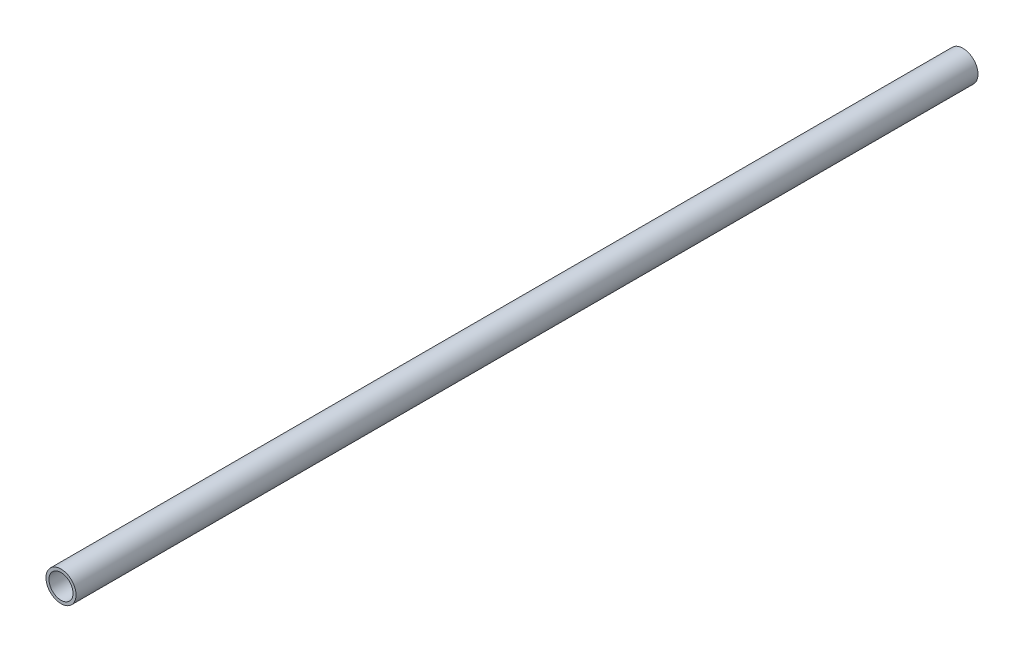
ISO-10303-21;
HEADER;
FILE_DESCRIPTION(('STEP AP214'),'2;1');
FILE_NAME('part.step','',(''),(''),'','','');
FILE_SCHEMA(('AUTOMOTIVE_DESIGN { 1 0 10303 214 1 1 1 1 }'));
ENDSEC;
DATA;
#1=APPLICATION_CONTEXT('core data for automotive mechanical design processes');
#2=APPLICATION_PROTOCOL_DEFINITION('international standard','automotive_design',2000,#1);
#3=PRODUCT_CONTEXT('',#1,'mechanical');
#4=PRODUCT('Part','Part','',(#3));
#5=PRODUCT_RELATED_PRODUCT_CATEGORY('part','',(#4));
#6=PRODUCT_DEFINITION_FORMATION('','',#4);
#7=PRODUCT_DEFINITION_CONTEXT('part definition',#1,'design');
#8=PRODUCT_DEFINITION('design','',#6,#7);
#9=PRODUCT_DEFINITION_SHAPE('','',#8);
#10=(LENGTH_UNIT() NAMED_UNIT(*) SI_UNIT(.MILLI.,.METRE.));
#11=(NAMED_UNIT(*) PLANE_ANGLE_UNIT() SI_UNIT($,.RADIAN.));
#12=(NAMED_UNIT(*) SI_UNIT($,.STERADIAN.) SOLID_ANGLE_UNIT());
#13=UNCERTAINTY_MEASURE_WITH_UNIT(LENGTH_MEASURE(1.E-05),#10,'distance_accuracy_value','');
#14=(GEOMETRIC_REPRESENTATION_CONTEXT(3) GLOBAL_UNCERTAINTY_ASSIGNED_CONTEXT((#13)) GLOBAL_UNIT_ASSIGNED_CONTEXT((#10,
#11,#12)) REPRESENTATION_CONTEXT('',''));
#15=CARTESIAN_POINT('',(0.,0.,0.));
#16=DIRECTION('',(0.,0.,1.));
#17=DIRECTION('',(1.,0.,0.));
#18=AXIS2_PLACEMENT_3D('',#15,#16,#17);
#19=CARTESIAN_POINT('',(0.,0.,300.));
#20=DIRECTION('',(0.,0.,1.));
#21=DIRECTION('',(1.,0.,0.));
#22=AXIS2_PLACEMENT_3D('',#19,#20,#21);
#23=PLANE('',#22);
#24=CARTESIAN_POINT('',(0.,0.,300.));
#25=DIRECTION('',(0.,0.,1.));
#26=DIRECTION('',(1.,0.,0.));
#27=AXIS2_PLACEMENT_3D('',#24,#25,#26);
#28=CIRCLE('',#27,5.);
#29=CARTESIAN_POINT('',(5.,0.,300.));
#30=VERTEX_POINT('',#29);
#31=EDGE_CURVE('E10',#30,#30,#28,.T.);
#32=ORIENTED_EDGE('',*,*,#31,.T.);
#33=EDGE_LOOP('',(#32));
#34=FACE_BOUND('',#33,.T.);
#35=CARTESIAN_POINT('',(0.,0.,300.));
#36=DIRECTION('',(0.,0.,1.));
#37=DIRECTION('',(1.,0.,0.));
#38=AXIS2_PLACEMENT_3D('',#35,#36,#37);
#39=CIRCLE('',#38,4.);
#40=CARTESIAN_POINT('',(4.,0.,300.));
#41=VERTEX_POINT('',#40);
#42=EDGE_CURVE('E46',#41,#41,#39,.T.);
#43=ORIENTED_EDGE('',*,*,#42,.F.);
#44=EDGE_LOOP('',(#43));
#45=FACE_BOUND('',#44,.T.);
#46=ADVANCED_FACE('F35',(#34,#45),#23,.T.);
#47=CARTESIAN_POINT('',(0.,0.,0.));
#48=DIRECTION('',(0.,0.,1.));
#49=DIRECTION('',(1.,0.,0.));
#50=AXIS2_PLACEMENT_3D('',#47,#48,#49);
#51=PLANE('',#50);
#52=CARTESIAN_POINT('',(0.,0.,0.));
#53=DIRECTION('',(0.,0.,1.));
#54=DIRECTION('',(1.,0.,0.));
#55=AXIS2_PLACEMENT_3D('',#52,#53,#54);
#56=CIRCLE('',#55,5.);
#57=CARTESIAN_POINT('',(5.,0.,0.));
#58=VERTEX_POINT('',#57);
#59=EDGE_CURVE('E39',#58,#58,#56,.T.);
#60=ORIENTED_EDGE('',*,*,#59,.F.);
#61=EDGE_LOOP('',(#60));
#62=FACE_BOUND('',#61,.T.);
#63=CARTESIAN_POINT('',(0.,0.,0.));
#64=DIRECTION('',(0.,0.,1.));
#65=DIRECTION('',(1.,0.,0.));
#66=AXIS2_PLACEMENT_3D('',#63,#64,#65);
#67=CIRCLE('',#66,4.);
#68=CARTESIAN_POINT('',(4.,0.,0.));
#69=VERTEX_POINT('',#68);
#70=EDGE_CURVE('E48',#69,#69,#67,.T.);
#71=ORIENTED_EDGE('',*,*,#70,.T.);
#72=EDGE_LOOP('',(#71));
#73=FACE_BOUND('',#72,.T.);
#74=ADVANCED_FACE('F58',(#62,#73),#51,.F.);
#75=CARTESIAN_POINT('',(0.,0.,300.));
#76=DIRECTION('',(0.,0.,-1.));
#77=DIRECTION('',(-1.,0.,0.));
#78=AXIS2_PLACEMENT_3D('',#75,#76,#77);
#79=CYLINDRICAL_SURFACE('',#78,5.);
#80=ORIENTED_EDGE('',*,*,#31,.F.);
#81=EDGE_LOOP('',(#80));
#82=FACE_BOUND('',#81,.T.);
#83=ORIENTED_EDGE('',*,*,#59,.T.);
#84=EDGE_LOOP('',(#83));
#85=FACE_BOUND('',#84,.T.);
#86=ADVANCED_FACE('F37',(#82,#85),#79,.T.);
#87=CARTESIAN_POINT('',(0.,0.,300.));
#88=DIRECTION('',(0.,0.,-1.));
#89=DIRECTION('',(-1.,0.,0.));
#90=AXIS2_PLACEMENT_3D('',#87,#88,#89);
#91=CYLINDRICAL_SURFACE('',#90,4.);
#92=ORIENTED_EDGE('',*,*,#42,.T.);
#93=EDGE_LOOP('',(#92));
#94=FACE_BOUND('',#93,.T.);
#95=ORIENTED_EDGE('',*,*,#70,.F.);
#96=EDGE_LOOP('',(#95));
#97=FACE_BOUND('',#96,.T.);
#98=ADVANCED_FACE('F54',(#94,#97),#91,.F.);
#99=CLOSED_SHELL('',(#46,#74,#86,#98));
#100=MANIFOLD_SOLID_BREP('B2',#99);
#101=ADVANCED_BREP_SHAPE_REPRESENTATION('',(#18,#100),#14);
#102=SHAPE_DEFINITION_REPRESENTATION(#9,#101);
ENDSEC;
END-ISO-10303-21;
